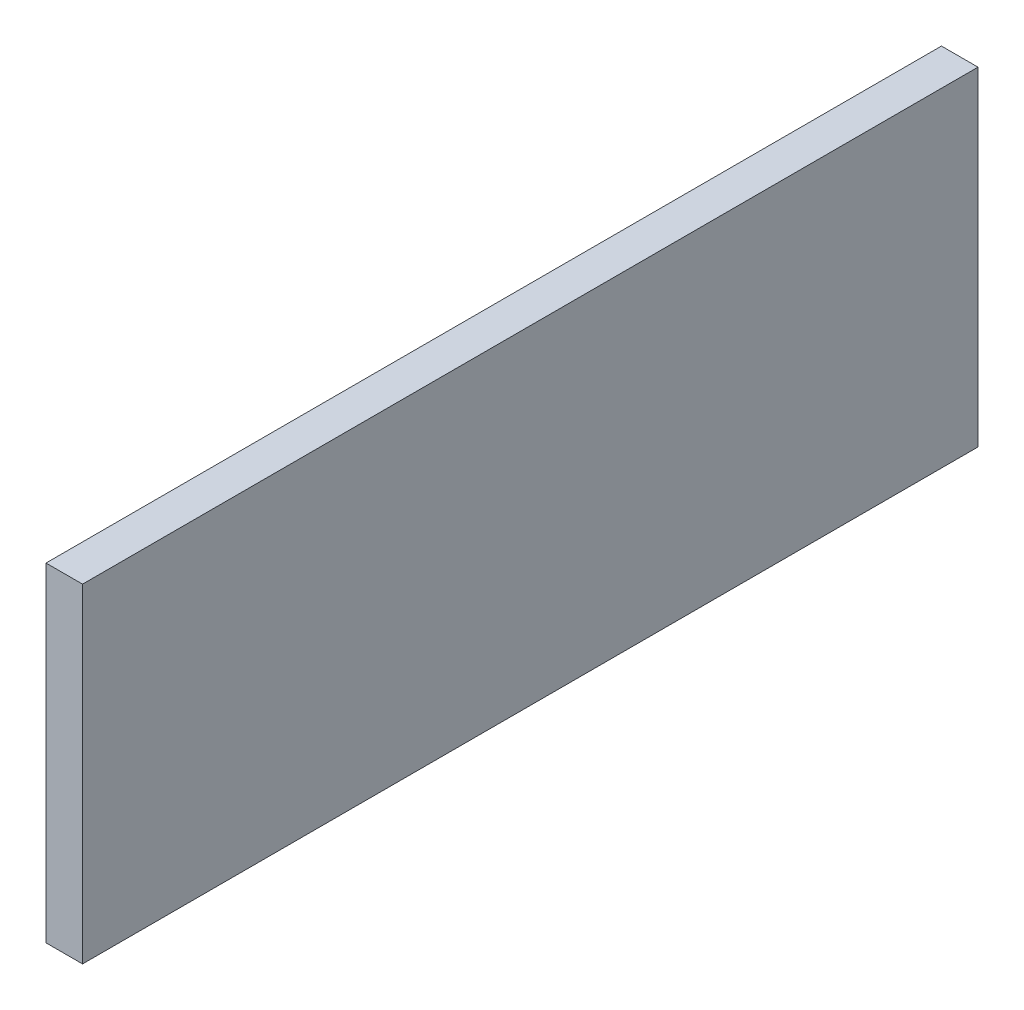
ISO-10303-21;
HEADER;
FILE_DESCRIPTION(('STEP AP214'),'2;1');
FILE_NAME('part.step','',(''),(''),'','','');
FILE_SCHEMA(('AUTOMOTIVE_DESIGN { 1 0 10303 214 1 1 1 1 }'));
ENDSEC;
DATA;
#1=APPLICATION_CONTEXT('core data for automotive mechanical design processes');
#2=APPLICATION_PROTOCOL_DEFINITION('international standard','automotive_design',2000,#1);
#3=PRODUCT_CONTEXT('',#1,'mechanical');
#4=PRODUCT('Part','Part','',(#3));
#5=PRODUCT_RELATED_PRODUCT_CATEGORY('part','',(#4));
#6=PRODUCT_DEFINITION_FORMATION('','',#4);
#7=PRODUCT_DEFINITION_CONTEXT('part definition',#1,'design');
#8=PRODUCT_DEFINITION('design','',#6,#7);
#9=PRODUCT_DEFINITION_SHAPE('','',#8);
#10=(LENGTH_UNIT() NAMED_UNIT(*) SI_UNIT(.MILLI.,.METRE.));
#11=(NAMED_UNIT(*) PLANE_ANGLE_UNIT() SI_UNIT($,.RADIAN.));
#12=(NAMED_UNIT(*) SI_UNIT($,.STERADIAN.) SOLID_ANGLE_UNIT());
#13=UNCERTAINTY_MEASURE_WITH_UNIT(LENGTH_MEASURE(1.E-05),#10,'distance_accuracy_value','');
#14=(GEOMETRIC_REPRESENTATION_CONTEXT(3) GLOBAL_UNCERTAINTY_ASSIGNED_CONTEXT((#13)) GLOBAL_UNIT_ASSIGNED_CONTEXT((#10,
#11,#12)) REPRESENTATION_CONTEXT('',''));
#15=CARTESIAN_POINT('',(0.,0.,0.));
#16=DIRECTION('',(0.,0.,1.));
#17=DIRECTION('',(1.,0.,0.));
#18=AXIS2_PLACEMENT_3D('',#15,#16,#17);
#19=CARTESIAN_POINT('',(12.7,0.,0.));
#20=DIRECTION('',(0.,0.,-1.));
#21=DIRECTION('',(-1.,0.,0.));
#22=AXIS2_PLACEMENT_3D('',#19,#20,#21);
#23=PLANE('',#22);
#24=DIRECTION('',(0.,-1.,0.));
#25=VECTOR('',#24,1.);
#26=CARTESIAN_POINT('',(0.,0.,0.));
#27=LINE('',#26,#25);
#28=CARTESIAN_POINT('',(0.,114.3,0.));
#29=VERTEX_POINT('',#28);
#30=CARTESIAN_POINT('',(0.,0.,0.));
#31=VERTEX_POINT('',#30);
#32=EDGE_CURVE('E96',#29,#31,#27,.T.);
#33=ORIENTED_EDGE('',*,*,#32,.T.);
#34=DIRECTION('',(-1.,0.,0.));
#35=VECTOR('',#34,1.);
#36=CARTESIAN_POINT('',(12.7,0.,0.));
#37=LINE('',#36,#35);
#38=CARTESIAN_POINT('',(12.7,0.,0.));
#39=VERTEX_POINT('',#38);
#40=EDGE_CURVE('E11',#39,#31,#37,.T.);
#41=ORIENTED_EDGE('',*,*,#40,.F.);
#42=DIRECTION('',(0.,-1.,0.));
#43=VECTOR('',#42,1.);
#44=CARTESIAN_POINT('',(12.7,0.,0.));
#45=LINE('',#44,#43);
#46=CARTESIAN_POINT('',(12.7,114.3,0.));
#47=VERTEX_POINT('',#46);
#48=EDGE_CURVE('E84',#47,#39,#45,.T.);
#49=ORIENTED_EDGE('',*,*,#48,.F.);
#50=DIRECTION('',(-1.,0.,0.));
#51=VECTOR('',#50,1.);
#52=CARTESIAN_POINT('',(12.7,114.3,0.));
#53=LINE('',#52,#51);
#54=EDGE_CURVE('E92',#47,#29,#53,.T.);
#55=ORIENTED_EDGE('',*,*,#54,.T.);
#56=EDGE_LOOP('',(#33,#41,#49,#55));
#57=FACE_BOUND('',#56,.T.);
#58=ADVANCED_FACE('F33',(#57),#23,.F.);
#59=CARTESIAN_POINT('',(12.7,0.,0.));
#60=DIRECTION('',(0.,1.,0.));
#61=DIRECTION('',(0.,0.,1.));
#62=AXIS2_PLACEMENT_3D('',#59,#60,#61);
#63=PLANE('',#62);
#64=DIRECTION('',(0.,0.,-1.));
#65=VECTOR('',#64,1.);
#66=CARTESIAN_POINT('',(0.,0.,0.));
#67=LINE('',#66,#65);
#68=CARTESIAN_POINT('',(0.,0.,-311.15));
#69=VERTEX_POINT('',#68);
#70=EDGE_CURVE('E88',#31,#69,#67,.T.);
#71=ORIENTED_EDGE('',*,*,#70,.T.);
#72=DIRECTION('',(-1.,0.,0.));
#73=VECTOR('',#72,1.);
#74=CARTESIAN_POINT('',(12.7,0.,-311.15));
#75=LINE('',#74,#73);
#76=CARTESIAN_POINT('',(12.7,0.,-311.15));
#77=VERTEX_POINT('',#76);
#78=EDGE_CURVE('E41',#77,#69,#75,.T.);
#79=ORIENTED_EDGE('',*,*,#78,.F.);
#80=DIRECTION('',(0.,0.,-1.));
#81=VECTOR('',#80,1.);
#82=CARTESIAN_POINT('',(12.7,0.,0.));
#83=LINE('',#82,#81);
#84=EDGE_CURVE('E79',#39,#77,#83,.T.);
#85=ORIENTED_EDGE('',*,*,#84,.F.);
#86=ORIENTED_EDGE('',*,*,#40,.T.);
#87=EDGE_LOOP('',(#71,#79,#85,#86));
#88=FACE_BOUND('',#87,.T.);
#89=ADVANCED_FACE('F87',(#88),#63,.F.);
#90=CARTESIAN_POINT('',(12.7,0.,-311.15));
#91=DIRECTION('',(0.,0.,1.));
#92=DIRECTION('',(1.,0.,0.));
#93=AXIS2_PLACEMENT_3D('',#90,#91,#92);
#94=PLANE('',#93);
#95=DIRECTION('',(0.,1.,0.));
#96=VECTOR('',#95,1.);
#97=CARTESIAN_POINT('',(0.,0.,-311.15));
#98=LINE('',#97,#96);
#99=CARTESIAN_POINT('',(0.,114.3,-311.15));
#100=VERTEX_POINT('',#99);
#101=EDGE_CURVE('E66',#69,#100,#98,.T.);
#102=ORIENTED_EDGE('',*,*,#101,.T.);
#103=DIRECTION('',(-1.,0.,0.));
#104=VECTOR('',#103,1.);
#105=CARTESIAN_POINT('',(12.7,114.3,-311.15));
#106=LINE('',#105,#104);
#107=CARTESIAN_POINT('',(12.7,114.3,-311.15));
#108=VERTEX_POINT('',#107);
#109=EDGE_CURVE('E89',#108,#100,#106,.T.);
#110=ORIENTED_EDGE('',*,*,#109,.F.);
#111=DIRECTION('',(0.,1.,0.));
#112=VECTOR('',#111,1.);
#113=CARTESIAN_POINT('',(12.7,0.,-311.15));
#114=LINE('',#113,#112);
#115=EDGE_CURVE('E82',#77,#108,#114,.T.);
#116=ORIENTED_EDGE('',*,*,#115,.F.);
#117=ORIENTED_EDGE('',*,*,#78,.T.);
#118=EDGE_LOOP('',(#102,#110,#116,#117));
#119=FACE_BOUND('',#118,.T.);
#120=ADVANCED_FACE('F90',(#119),#94,.F.);
#121=CARTESIAN_POINT('',(12.7,114.3,0.));
#122=DIRECTION('',(0.,-1.,0.));
#123=DIRECTION('',(0.,0.,-1.));
#124=AXIS2_PLACEMENT_3D('',#121,#122,#123);
#125=PLANE('',#124);
#126=DIRECTION('',(0.,0.,1.));
#127=VECTOR('',#126,1.);
#128=CARTESIAN_POINT('',(0.,114.3,0.));
#129=LINE('',#128,#127);
#130=EDGE_CURVE('E72',#100,#29,#129,.T.);
#131=ORIENTED_EDGE('',*,*,#130,.T.);
#132=ORIENTED_EDGE('',*,*,#54,.F.);
#133=DIRECTION('',(0.,0.,1.));
#134=VECTOR('',#133,1.);
#135=CARTESIAN_POINT('',(12.7,114.3,0.));
#136=LINE('',#135,#134);
#137=EDGE_CURVE('E49',#108,#47,#136,.T.);
#138=ORIENTED_EDGE('',*,*,#137,.F.);
#139=ORIENTED_EDGE('',*,*,#109,.T.);
#140=EDGE_LOOP('',(#131,#132,#138,#139));
#141=FACE_BOUND('',#140,.T.);
#142=ADVANCED_FACE('F103',(#141),#125,.F.);
#143=CARTESIAN_POINT('',(12.7,0.,0.));
#144=DIRECTION('',(-1.,0.,0.));
#145=DIRECTION('',(0.,0.,1.));
#146=AXIS2_PLACEMENT_3D('',#143,#144,#145);
#147=PLANE('',#146);
#148=ORIENTED_EDGE('',*,*,#48,.T.);
#149=ORIENTED_EDGE('',*,*,#84,.T.);
#150=ORIENTED_EDGE('',*,*,#115,.T.);
#151=ORIENTED_EDGE('',*,*,#137,.T.);
#152=EDGE_LOOP('',(#148,#149,#150,#151));
#153=FACE_BOUND('',#152,.T.);
#154=ADVANCED_FACE('F80',(#153),#147,.F.);
#155=CARTESIAN_POINT('',(0.,0.,0.));
#156=DIRECTION('',(-1.,0.,0.));
#157=DIRECTION('',(0.,0.,1.));
#158=AXIS2_PLACEMENT_3D('',#155,#156,#157);
#159=PLANE('',#158);
#160=ORIENTED_EDGE('',*,*,#32,.F.);
#161=ORIENTED_EDGE('',*,*,#130,.F.);
#162=ORIENTED_EDGE('',*,*,#101,.F.);
#163=ORIENTED_EDGE('',*,*,#70,.F.);
#164=EDGE_LOOP('',(#160,#161,#162,#163));
#165=FACE_BOUND('',#164,.T.);
#166=ADVANCED_FACE('F106',(#165),#159,.T.);
#167=CLOSED_SHELL('',(#58,#89,#120,#142,#154,#166));
#168=MANIFOLD_SOLID_BREP('B2',#167);
#169=ADVANCED_BREP_SHAPE_REPRESENTATION('',(#18,#168),#14);
#170=SHAPE_DEFINITION_REPRESENTATION(#9,#169);
ENDSEC;
END-ISO-10303-21;
